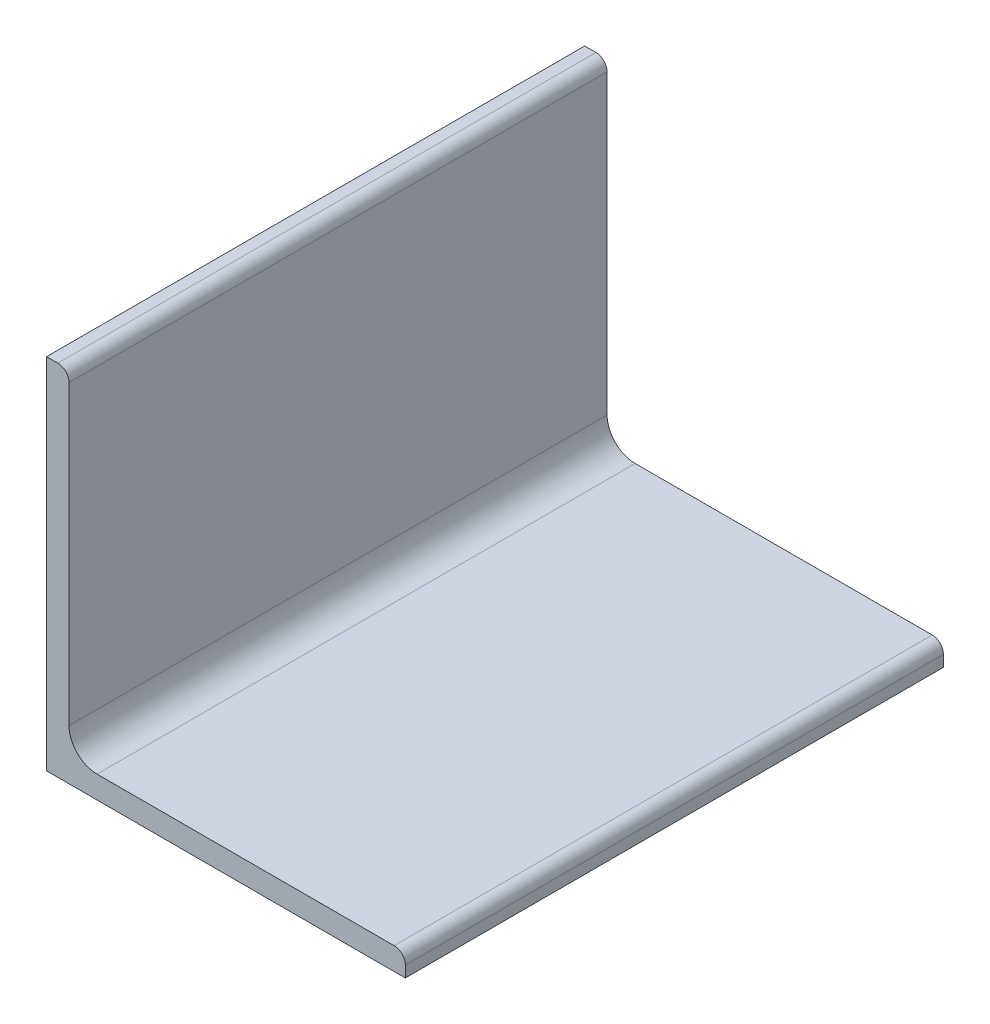
ISO-10303-21;
HEADER;
FILE_DESCRIPTION(('STEP AP214'),'2;1');
FILE_NAME('part.step','',(''),(''),'','','');
FILE_SCHEMA(('AUTOMOTIVE_DESIGN { 1 0 10303 214 1 1 1 1 }'));
ENDSEC;
DATA;
#1=APPLICATION_CONTEXT('core data for automotive mechanical design processes');
#2=APPLICATION_PROTOCOL_DEFINITION('international standard','automotive_design',2000,#1);
#3=PRODUCT_CONTEXT('',#1,'mechanical');
#4=PRODUCT('Part','Part','',(#3));
#5=PRODUCT_RELATED_PRODUCT_CATEGORY('part','',(#4));
#6=PRODUCT_DEFINITION_FORMATION('','',#4);
#7=PRODUCT_DEFINITION_CONTEXT('part definition',#1,'design');
#8=PRODUCT_DEFINITION('design','',#6,#7);
#9=PRODUCT_DEFINITION_SHAPE('','',#8);
#10=(LENGTH_UNIT() NAMED_UNIT(*) SI_UNIT(.MILLI.,.METRE.));
#11=(NAMED_UNIT(*) PLANE_ANGLE_UNIT() SI_UNIT($,.RADIAN.));
#12=(NAMED_UNIT(*) SI_UNIT($,.STERADIAN.) SOLID_ANGLE_UNIT());
#13=UNCERTAINTY_MEASURE_WITH_UNIT(LENGTH_MEASURE(1.E-05),#10,'distance_accuracy_value','');
#14=(GEOMETRIC_REPRESENTATION_CONTEXT(3) GLOBAL_UNCERTAINTY_ASSIGNED_CONTEXT((#13)) GLOBAL_UNIT_ASSIGNED_CONTEXT((#10,
#11,#12)) REPRESENTATION_CONTEXT('',''));
#15=CARTESIAN_POINT('',(0.,0.,0.));
#16=DIRECTION('',(0.,0.,1.));
#17=DIRECTION('',(1.,0.,0.));
#18=AXIS2_PLACEMENT_3D('',#15,#16,#17);
#19=CARTESIAN_POINT('',(1.17355224493876,203.678837479772,304.8));
#20=DIRECTION('',(1.,0.,0.));
#21=DIRECTION('',(0.,0.,-1.));
#22=AXIS2_PLACEMENT_3D('',#19,#20,#21);
#23=PLANE('',#22);
#24=DIRECTION('',(0.,-1.,0.));
#25=VECTOR('',#24,1.);
#26=CARTESIAN_POINT('',(1.17355224493876,203.678837479772,0.));
#27=LINE('',#26,#25);
#28=CARTESIAN_POINT('',(1.17355224493876,203.678837479772,0.));
#29=VERTEX_POINT('',#28);
#30=CARTESIAN_POINT('',(1.17355224493876,0.478837479771528,0.));
#31=VERTEX_POINT('',#30);
#32=EDGE_CURVE('E135',#29,#31,#27,.T.);
#33=ORIENTED_EDGE('',*,*,#32,.T.);
#34=DIRECTION('',(0.,0.,-1.));
#35=VECTOR('',#34,1.);
#36=CARTESIAN_POINT('',(1.17355224493876,0.478837479771528,304.8));
#37=LINE('',#36,#35);
#38=CARTESIAN_POINT('',(1.17355224493876,0.478837479771528,304.8));
#39=VERTEX_POINT('',#38);
#40=EDGE_CURVE('E11',#39,#31,#37,.T.);
#41=ORIENTED_EDGE('',*,*,#40,.F.);
#42=DIRECTION('',(0.,-1.,0.));
#43=VECTOR('',#42,1.);
#44=CARTESIAN_POINT('',(1.17355224493876,203.678837479772,304.8));
#45=LINE('',#44,#43);
#46=CARTESIAN_POINT('',(1.17355224493876,203.678837479772,304.8));
#47=VERTEX_POINT('',#46);
#48=EDGE_CURVE('E151',#47,#39,#45,.T.);
#49=ORIENTED_EDGE('',*,*,#48,.F.);
#50=DIRECTION('',(0.,0.,-1.));
#51=VECTOR('',#50,1.);
#52=CARTESIAN_POINT('',(1.17355224493876,203.678837479772,304.8));
#53=LINE('',#52,#51);
#54=EDGE_CURVE('E131',#47,#29,#53,.T.);
#55=ORIENTED_EDGE('',*,*,#54,.T.);
#56=EDGE_LOOP('',(#33,#41,#49,#55));
#57=FACE_BOUND('',#56,.T.);
#58=ADVANCED_FACE('F33',(#57),#23,.F.);
#59=CARTESIAN_POINT('',(1.17355224493876,0.478837479771528,304.8));
#60=DIRECTION('',(0.,1.,0.));
#61=DIRECTION('',(0.,0.,1.));
#62=AXIS2_PLACEMENT_3D('',#59,#60,#61);
#63=PLANE('',#62);
#64=DIRECTION('',(1.,0.,0.));
#65=VECTOR('',#64,1.);
#66=CARTESIAN_POINT('',(1.17355224493876,0.478837479771528,0.));
#67=LINE('',#66,#65);
#68=CARTESIAN_POINT('',(204.373552244939,0.478837479771528,0.));
#69=VERTEX_POINT('',#68);
#70=EDGE_CURVE('E138',#31,#69,#67,.T.);
#71=ORIENTED_EDGE('',*,*,#70,.T.);
#72=DIRECTION('',(0.,0.,-1.));
#73=VECTOR('',#72,1.);
#74=CARTESIAN_POINT('',(204.373552244939,0.478837479771528,304.8));
#75=LINE('',#74,#73);
#76=CARTESIAN_POINT('',(204.373552244939,0.478837479771528,304.8));
#77=VERTEX_POINT('',#76);
#78=EDGE_CURVE('E41',#77,#69,#75,.T.);
#79=ORIENTED_EDGE('',*,*,#78,.F.);
#80=DIRECTION('',(1.,0.,0.));
#81=VECTOR('',#80,1.);
#82=CARTESIAN_POINT('',(1.17355224493876,0.478837479771528,304.8));
#83=LINE('',#82,#81);
#84=EDGE_CURVE('E95',#39,#77,#83,.T.);
#85=ORIENTED_EDGE('',*,*,#84,.F.);
#86=ORIENTED_EDGE('',*,*,#40,.T.);
#87=EDGE_LOOP('',(#71,#79,#85,#86));
#88=FACE_BOUND('',#87,.T.);
#89=ADVANCED_FACE('F194',(#88),#63,.F.);
#90=CARTESIAN_POINT('',(204.373552244939,0.478837479771528,304.8));
#91=DIRECTION('',(-1.,0.,0.));
#92=DIRECTION('',(0.,0.,1.));
#93=AXIS2_PLACEMENT_3D('',#90,#91,#92);
#94=PLANE('',#93);
#95=DIRECTION('',(0.,1.,0.));
#96=VECTOR('',#95,1.);
#97=CARTESIAN_POINT('',(204.373552244939,0.478837479771528,0.));
#98=LINE('',#97,#96);
#99=CARTESIAN_POINT('',(204.373552244939,6.82883747977153,0.));
#100=VERTEX_POINT('',#99);
#101=EDGE_CURVE('E140',#69,#100,#98,.T.);
#102=ORIENTED_EDGE('',*,*,#101,.T.);
#103=DIRECTION('',(0.,0.,-1.));
#104=VECTOR('',#103,1.);
#105=CARTESIAN_POINT('',(204.373552244939,6.82883747977153,304.8));
#106=LINE('',#105,#104);
#107=CARTESIAN_POINT('',(204.373552244939,6.82883747977153,304.8));
#108=VERTEX_POINT('',#107);
#109=EDGE_CURVE('E161',#108,#100,#106,.T.);
#110=ORIENTED_EDGE('',*,*,#109,.F.);
#111=DIRECTION('',(0.,1.,0.));
#112=VECTOR('',#111,1.);
#113=CARTESIAN_POINT('',(204.373552244939,0.478837479771528,304.8));
#114=LINE('',#113,#112);
#115=EDGE_CURVE('E169',#77,#108,#114,.T.);
#116=ORIENTED_EDGE('',*,*,#115,.F.);
#117=ORIENTED_EDGE('',*,*,#78,.T.);
#118=EDGE_LOOP('',(#102,#110,#116,#117));
#119=FACE_BOUND('',#118,.T.);
#120=ADVANCED_FACE('F167',(#119),#94,.F.);
#121=CARTESIAN_POINT('',(198.023552244939,6.82883747977154,304.8));
#122=DIRECTION('',(0.,0.,-1.));
#123=DIRECTION('',(-1.,0.,0.));
#124=AXIS2_PLACEMENT_3D('',#121,#122,#123);
#125=CYLINDRICAL_SURFACE('',#124,6.34999999999999);
#126=CARTESIAN_POINT('',(198.023552244939,6.82883747977154,0.));
#127=DIRECTION('',(0.,0.,1.));
#128=DIRECTION('',(1.,0.,0.));
#129=AXIS2_PLACEMENT_3D('',#126,#127,#128);
#130=CIRCLE('',#129,6.34999999999999);
#131=CARTESIAN_POINT('',(198.023552244939,13.1788374797715,0.));
#132=VERTEX_POINT('',#131);
#133=EDGE_CURVE('E142',#100,#132,#130,.T.);
#134=ORIENTED_EDGE('',*,*,#133,.T.);
#135=DIRECTION('',(0.,0.,-1.));
#136=VECTOR('',#135,1.);
#137=CARTESIAN_POINT('',(198.023552244939,13.1788374797715,304.8));
#138=LINE('',#137,#136);
#139=CARTESIAN_POINT('',(198.023552244939,13.1788374797715,304.8));
#140=VERTEX_POINT('',#139);
#141=EDGE_CURVE('E158',#140,#132,#138,.T.);
#142=ORIENTED_EDGE('',*,*,#141,.F.);
#143=CARTESIAN_POINT('',(198.023552244939,6.82883747977154,304.8));
#144=DIRECTION('',(0.,0.,1.));
#145=DIRECTION('',(1.,0.,0.));
#146=AXIS2_PLACEMENT_3D('',#143,#144,#145);
#147=CIRCLE('',#146,6.34999999999999);
#148=EDGE_CURVE('E185',#108,#140,#147,.T.);
#149=ORIENTED_EDGE('',*,*,#148,.F.);
#150=ORIENTED_EDGE('',*,*,#109,.T.);
#151=EDGE_LOOP('',(#134,#142,#149,#150));
#152=FACE_BOUND('',#151,.T.);
#153=ADVANCED_FACE('F178',(#152),#125,.T.);
#154=CARTESIAN_POINT('',(198.023552244939,13.1788374797715,304.8));
#155=DIRECTION('',(0.,-1.,0.));
#156=DIRECTION('',(1.,0.,0.));
#157=AXIS2_PLACEMENT_3D('',#154,#155,#156);
#158=PLANE('',#157);
#159=DIRECTION('',(-1.,0.,0.));
#160=VECTOR('',#159,1.);
#161=CARTESIAN_POINT('',(198.023552244939,13.1788374797715,0.));
#162=LINE('',#161,#160);
#163=CARTESIAN_POINT('',(29.7485522449388,13.1788374797716,0.));
#164=VERTEX_POINT('',#163);
#165=EDGE_CURVE('E144',#132,#164,#162,.T.);
#166=ORIENTED_EDGE('',*,*,#165,.T.);
#167=DIRECTION('',(0.,0.,-1.));
#168=VECTOR('',#167,1.);
#169=CARTESIAN_POINT('',(29.7485522449388,13.1788374797716,304.8));
#170=LINE('',#169,#168);
#171=CARTESIAN_POINT('',(29.7485522449388,13.1788374797716,304.8));
#172=VERTEX_POINT('',#171);
#173=EDGE_CURVE('E155',#172,#164,#170,.T.);
#174=ORIENTED_EDGE('',*,*,#173,.F.);
#175=DIRECTION('',(-1.,0.,0.));
#176=VECTOR('',#175,1.);
#177=CARTESIAN_POINT('',(198.023552244939,13.1788374797715,304.8));
#178=LINE('',#177,#176);
#179=EDGE_CURVE('E184',#140,#172,#178,.T.);
#180=ORIENTED_EDGE('',*,*,#179,.F.);
#181=ORIENTED_EDGE('',*,*,#141,.T.);
#182=EDGE_LOOP('',(#166,#174,#180,#181));
#183=FACE_BOUND('',#182,.T.);
#184=ADVANCED_FACE('F182',(#183),#158,.F.);
#185=CARTESIAN_POINT('',(29.7485522449387,29.0538374797715,304.8));
#186=DIRECTION('',(0.,0.,-1.));
#187=DIRECTION('',(-1.,0.,0.));
#188=AXIS2_PLACEMENT_3D('',#185,#186,#187);
#189=CYLINDRICAL_SURFACE('',#188,15.875);
#190=CARTESIAN_POINT('',(29.7485522449387,29.0538374797715,0.));
#191=DIRECTION('',(0.,0.,-1.));
#192=DIRECTION('',(1.,0.,0.));
#193=AXIS2_PLACEMENT_3D('',#190,#191,#192);
#194=CIRCLE('',#193,15.875);
#195=CARTESIAN_POINT('',(13.8735522449388,29.0538374797715,0.));
#196=VERTEX_POINT('',#195);
#197=EDGE_CURVE('E146',#164,#196,#194,.T.);
#198=ORIENTED_EDGE('',*,*,#197,.T.);
#199=DIRECTION('',(0.,0.,-1.));
#200=VECTOR('',#199,1.);
#201=CARTESIAN_POINT('',(13.8735522449388,29.0538374797715,304.8));
#202=LINE('',#201,#200);
#203=CARTESIAN_POINT('',(13.8735522449388,29.0538374797715,304.8));
#204=VERTEX_POINT('',#203);
#205=EDGE_CURVE('E126',#204,#196,#202,.T.);
#206=ORIENTED_EDGE('',*,*,#205,.F.);
#207=CARTESIAN_POINT('',(29.7485522449387,29.0538374797715,304.8));
#208=DIRECTION('',(0.,0.,-1.));
#209=DIRECTION('',(1.,0.,0.));
#210=AXIS2_PLACEMENT_3D('',#207,#208,#209);
#211=CIRCLE('',#210,15.875);
#212=EDGE_CURVE('E117',#172,#204,#211,.T.);
#213=ORIENTED_EDGE('',*,*,#212,.F.);
#214=ORIENTED_EDGE('',*,*,#173,.T.);
#215=EDGE_LOOP('',(#198,#206,#213,#214));
#216=FACE_BOUND('',#215,.T.);
#217=ADVANCED_FACE('F206',(#216),#189,.F.);
#218=CARTESIAN_POINT('',(13.8735522449388,29.0538374797715,304.8));
#219=DIRECTION('',(-1.,0.,0.));
#220=DIRECTION('',(0.,0.,1.));
#221=AXIS2_PLACEMENT_3D('',#218,#219,#220);
#222=PLANE('',#221);
#223=DIRECTION('',(0.,1.,0.));
#224=VECTOR('',#223,1.);
#225=CARTESIAN_POINT('',(13.8735522449388,29.0538374797715,0.));
#226=LINE('',#225,#224);
#227=CARTESIAN_POINT('',(13.8735522449388,197.328837479771,0.));
#228=VERTEX_POINT('',#227);
#229=EDGE_CURVE('E125',#196,#228,#226,.T.);
#230=ORIENTED_EDGE('',*,*,#229,.T.);
#231=DIRECTION('',(0.,0.,-1.));
#232=VECTOR('',#231,1.);
#233=CARTESIAN_POINT('',(13.8735522449388,197.328837479771,304.8));
#234=LINE('',#233,#232);
#235=CARTESIAN_POINT('',(13.8735522449388,197.328837479771,304.8));
#236=VERTEX_POINT('',#235);
#237=EDGE_CURVE('E122',#236,#228,#234,.T.);
#238=ORIENTED_EDGE('',*,*,#237,.F.);
#239=DIRECTION('',(0.,1.,0.));
#240=VECTOR('',#239,1.);
#241=CARTESIAN_POINT('',(13.8735522449388,29.0538374797715,304.8));
#242=LINE('',#241,#240);
#243=EDGE_CURVE('E111',#204,#236,#242,.T.);
#244=ORIENTED_EDGE('',*,*,#243,.F.);
#245=ORIENTED_EDGE('',*,*,#205,.T.);
#246=EDGE_LOOP('',(#230,#238,#244,#245));
#247=FACE_BOUND('',#246,.T.);
#248=ADVANCED_FACE('F123',(#247),#222,.F.);
#249=CARTESIAN_POINT('',(7.52355224493875,197.328837479772,304.8));
#250=DIRECTION('',(0.,0.,-1.));
#251=DIRECTION('',(-1.,0.,0.));
#252=AXIS2_PLACEMENT_3D('',#249,#250,#251);
#253=CYLINDRICAL_SURFACE('',#252,6.35);
#254=CARTESIAN_POINT('',(7.52355224493875,197.328837479772,0.));
#255=DIRECTION('',(0.,0.,1.));
#256=DIRECTION('',(1.,0.,0.));
#257=AXIS2_PLACEMENT_3D('',#254,#255,#256);
#258=CIRCLE('',#257,6.35);
#259=CARTESIAN_POINT('',(7.52355224493876,203.678837479772,0.));
#260=VERTEX_POINT('',#259);
#261=EDGE_CURVE('E81',#228,#260,#258,.T.);
#262=ORIENTED_EDGE('',*,*,#261,.T.);
#263=DIRECTION('',(0.,0.,-1.));
#264=VECTOR('',#263,1.);
#265=CARTESIAN_POINT('',(7.52355224493876,203.678837479772,304.8));
#266=LINE('',#265,#264);
#267=CARTESIAN_POINT('',(7.52355224493876,203.678837479772,304.8));
#268=VERTEX_POINT('',#267);
#269=EDGE_CURVE('E127',#268,#260,#266,.T.);
#270=ORIENTED_EDGE('',*,*,#269,.F.);
#271=CARTESIAN_POINT('',(7.52355224493875,197.328837479772,304.8));
#272=DIRECTION('',(0.,0.,1.));
#273=DIRECTION('',(1.,0.,0.));
#274=AXIS2_PLACEMENT_3D('',#271,#272,#273);
#275=CIRCLE('',#274,6.35);
#276=EDGE_CURVE('E115',#236,#268,#275,.T.);
#277=ORIENTED_EDGE('',*,*,#276,.F.);
#278=ORIENTED_EDGE('',*,*,#237,.T.);
#279=EDGE_LOOP('',(#262,#270,#277,#278));
#280=FACE_BOUND('',#279,.T.);
#281=ADVANCED_FACE('F129',(#280),#253,.T.);
#282=CARTESIAN_POINT('',(7.52355224493876,203.678837479772,304.8));
#283=DIRECTION('',(0.,-1.,0.));
#284=DIRECTION('',(0.,0.,-1.));
#285=AXIS2_PLACEMENT_3D('',#282,#283,#284);
#286=PLANE('',#285);
#287=DIRECTION('',(-1.,0.,0.));
#288=VECTOR('',#287,1.);
#289=CARTESIAN_POINT('',(7.52355224493876,203.678837479772,0.));
#290=LINE('',#289,#288);
#291=EDGE_CURVE('E87',#260,#29,#290,.T.);
#292=ORIENTED_EDGE('',*,*,#291,.T.);
#293=ORIENTED_EDGE('',*,*,#54,.F.);
#294=DIRECTION('',(-1.,0.,0.));
#295=VECTOR('',#294,1.);
#296=CARTESIAN_POINT('',(7.52355224493876,203.678837479772,304.8));
#297=LINE('',#296,#295);
#298=EDGE_CURVE('E49',#268,#47,#297,.T.);
#299=ORIENTED_EDGE('',*,*,#298,.F.);
#300=ORIENTED_EDGE('',*,*,#269,.T.);
#301=EDGE_LOOP('',(#292,#293,#299,#300));
#302=FACE_BOUND('',#301,.T.);
#303=ADVANCED_FACE('F214',(#302),#286,.F.);
#304=CARTESIAN_POINT('',(198.023552244939,6.82883747977154,304.8));
#305=DIRECTION('',(0.,0.,1.));
#306=DIRECTION('',(1.,0.,0.));
#307=AXIS2_PLACEMENT_3D('',#304,#305,#306);
#308=PLANE('',#307);
#309=ORIENTED_EDGE('',*,*,#48,.T.);
#310=ORIENTED_EDGE('',*,*,#84,.T.);
#311=ORIENTED_EDGE('',*,*,#115,.T.);
#312=ORIENTED_EDGE('',*,*,#148,.T.);
#313=ORIENTED_EDGE('',*,*,#179,.T.);
#314=ORIENTED_EDGE('',*,*,#212,.T.);
#315=ORIENTED_EDGE('',*,*,#243,.T.);
#316=ORIENTED_EDGE('',*,*,#276,.T.);
#317=ORIENTED_EDGE('',*,*,#298,.T.);
#318=EDGE_LOOP('',(#309,#310,#311,#312,#313,#314,#315,#316,#317));
#319=FACE_BOUND('',#318,.T.);
#320=ADVANCED_FACE('F113',(#319),#308,.T.);
#321=CARTESIAN_POINT('',(198.023552244939,6.82883747977154,0.));
#322=DIRECTION('',(0.,0.,1.));
#323=DIRECTION('',(1.,0.,0.));
#324=AXIS2_PLACEMENT_3D('',#321,#322,#323);
#325=PLANE('',#324);
#326=ORIENTED_EDGE('',*,*,#32,.F.);
#327=ORIENTED_EDGE('',*,*,#291,.F.);
#328=ORIENTED_EDGE('',*,*,#261,.F.);
#329=ORIENTED_EDGE('',*,*,#229,.F.);
#330=ORIENTED_EDGE('',*,*,#197,.F.);
#331=ORIENTED_EDGE('',*,*,#165,.F.);
#332=ORIENTED_EDGE('',*,*,#133,.F.);
#333=ORIENTED_EDGE('',*,*,#101,.F.);
#334=ORIENTED_EDGE('',*,*,#70,.F.);
#335=EDGE_LOOP('',(#326,#327,#328,#329,#330,#331,#332,#333,#334));
#336=FACE_BOUND('',#335,.T.);
#337=ADVANCED_FACE('F173',(#336),#325,.F.);
#338=CLOSED_SHELL('',(#58,#89,#120,#153,#184,#217,#248,#281,#303,#320,#337));
#339=MANIFOLD_SOLID_BREP('B2',#338);
#340=ADVANCED_BREP_SHAPE_REPRESENTATION('',(#18,#339),#14);
#341=SHAPE_DEFINITION_REPRESENTATION(#9,#340);
ENDSEC;
END-ISO-10303-21;
